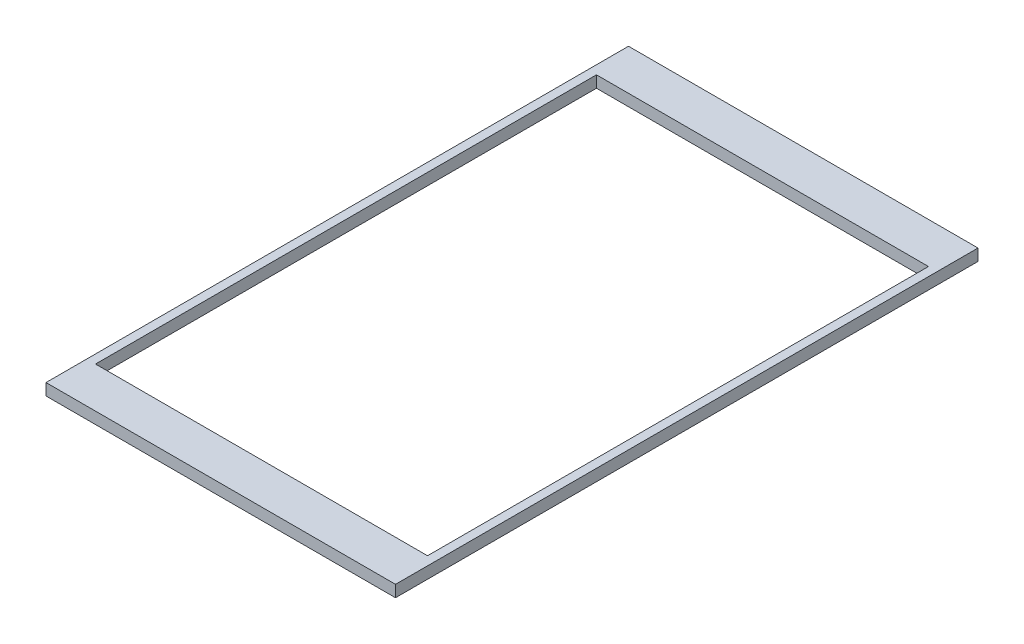
ISO-10303-21;
HEADER;
FILE_DESCRIPTION(('STEP AP214'),'2;1');
FILE_NAME('part.step','',(''),(''),'','','');
FILE_SCHEMA(('AUTOMOTIVE_DESIGN { 1 0 10303 214 1 1 1 1 }'));
ENDSEC;
DATA;
#1=APPLICATION_CONTEXT('core data for automotive mechanical design processes');
#2=APPLICATION_PROTOCOL_DEFINITION('international standard','automotive_design',2000,#1);
#3=PRODUCT_CONTEXT('',#1,'mechanical');
#4=PRODUCT('Part','Part','',(#3));
#5=PRODUCT_RELATED_PRODUCT_CATEGORY('part','',(#4));
#6=PRODUCT_DEFINITION_FORMATION('','',#4);
#7=PRODUCT_DEFINITION_CONTEXT('part definition',#1,'design');
#8=PRODUCT_DEFINITION('design','',#6,#7);
#9=PRODUCT_DEFINITION_SHAPE('','',#8);
#10=(LENGTH_UNIT() NAMED_UNIT(*) SI_UNIT(.MILLI.,.METRE.));
#11=(NAMED_UNIT(*) PLANE_ANGLE_UNIT() SI_UNIT($,.RADIAN.));
#12=(NAMED_UNIT(*) SI_UNIT($,.STERADIAN.) SOLID_ANGLE_UNIT());
#13=UNCERTAINTY_MEASURE_WITH_UNIT(LENGTH_MEASURE(1.E-05),#10,'distance_accuracy_value','');
#14=(GEOMETRIC_REPRESENTATION_CONTEXT(3) GLOBAL_UNCERTAINTY_ASSIGNED_CONTEXT((#13)) GLOBAL_UNIT_ASSIGNED_CONTEXT((#10,
#11,#12)) REPRESENTATION_CONTEXT('',''));
#15=CARTESIAN_POINT('',(0.,0.,0.));
#16=DIRECTION('',(0.,0.,1.));
#17=DIRECTION('',(1.,0.,0.));
#18=AXIS2_PLACEMENT_3D('',#15,#16,#17);
#19=CARTESIAN_POINT('',(38.1,2.54,63.5));
#20=DIRECTION('',(-1.,0.,0.));
#21=DIRECTION('',(0.,0.,1.));
#22=AXIS2_PLACEMENT_3D('',#19,#20,#21);
#23=PLANE('',#22);
#24=DIRECTION('',(0.,0.,-1.));
#25=VECTOR('',#24,1.);
#26=CARTESIAN_POINT('',(38.1,0.,63.5));
#27=LINE('',#26,#25);
#28=CARTESIAN_POINT('',(38.1,0.,63.5));
#29=VERTEX_POINT('',#28);
#30=CARTESIAN_POINT('',(38.1,0.,-63.5));
#31=VERTEX_POINT('',#30);
#32=EDGE_CURVE('E130',#29,#31,#27,.T.);
#33=ORIENTED_EDGE('',*,*,#32,.T.);
#34=DIRECTION('',(0.,-1.,0.));
#35=VECTOR('',#34,1.);
#36=CARTESIAN_POINT('',(38.1,2.54,-63.5));
#37=LINE('',#36,#35);
#38=CARTESIAN_POINT('',(38.1,2.54,-63.5));
#39=VERTEX_POINT('',#38);
#40=EDGE_CURVE('E11',#39,#31,#37,.T.);
#41=ORIENTED_EDGE('',*,*,#40,.F.);
#42=DIRECTION('',(0.,0.,-1.));
#43=VECTOR('',#42,1.);
#44=CARTESIAN_POINT('',(38.1,2.54,63.5));
#45=LINE('',#44,#43);
#46=CARTESIAN_POINT('',(38.1,2.54,63.5));
#47=VERTEX_POINT('',#46);
#48=EDGE_CURVE('E134',#47,#39,#45,.T.);
#49=ORIENTED_EDGE('',*,*,#48,.F.);
#50=DIRECTION('',(0.,-1.,0.));
#51=VECTOR('',#50,1.);
#52=CARTESIAN_POINT('',(38.1,2.54,63.5));
#53=LINE('',#52,#51);
#54=EDGE_CURVE('E144',#47,#29,#53,.T.);
#55=ORIENTED_EDGE('',*,*,#54,.T.);
#56=EDGE_LOOP('',(#33,#41,#49,#55));
#57=FACE_BOUND('',#56,.T.);
#58=ADVANCED_FACE('F33',(#57),#23,.F.);
#59=CARTESIAN_POINT('',(-38.1,2.54,-63.5));
#60=DIRECTION('',(0.,0.,1.));
#61=DIRECTION('',(1.,0.,0.));
#62=AXIS2_PLACEMENT_3D('',#59,#60,#61);
#63=PLANE('',#62);
#64=DIRECTION('',(-1.,0.,0.));
#65=VECTOR('',#64,1.);
#66=CARTESIAN_POINT('',(-38.1,0.,-63.5));
#67=LINE('',#66,#65);
#68=CARTESIAN_POINT('',(-38.1,0.,-63.5));
#69=VERTEX_POINT('',#68);
#70=EDGE_CURVE('E147',#31,#69,#67,.T.);
#71=ORIENTED_EDGE('',*,*,#70,.T.);
#72=DIRECTION('',(0.,-1.,0.));
#73=VECTOR('',#72,1.);
#74=CARTESIAN_POINT('',(-38.1,2.54,-63.5));
#75=LINE('',#74,#73);
#76=CARTESIAN_POINT('',(-38.1,2.54,-63.5));
#77=VERTEX_POINT('',#76);
#78=EDGE_CURVE('E40',#77,#69,#75,.T.);
#79=ORIENTED_EDGE('',*,*,#78,.F.);
#80=DIRECTION('',(-1.,0.,0.));
#81=VECTOR('',#80,1.);
#82=CARTESIAN_POINT('',(-38.1,2.54,-63.5));
#83=LINE('',#82,#81);
#84=EDGE_CURVE('E137',#39,#77,#83,.T.);
#85=ORIENTED_EDGE('',*,*,#84,.F.);
#86=ORIENTED_EDGE('',*,*,#40,.T.);
#87=EDGE_LOOP('',(#71,#79,#85,#86));
#88=FACE_BOUND('',#87,.T.);
#89=ADVANCED_FACE('F175',(#88),#63,.F.);
#90=CARTESIAN_POINT('',(-38.1,2.54,63.5));
#91=DIRECTION('',(1.,0.,0.));
#92=DIRECTION('',(0.,0.,-1.));
#93=AXIS2_PLACEMENT_3D('',#90,#91,#92);
#94=PLANE('',#93);
#95=DIRECTION('',(0.,0.,1.));
#96=VECTOR('',#95,1.);
#97=CARTESIAN_POINT('',(-38.1,0.,63.5));
#98=LINE('',#97,#96);
#99=CARTESIAN_POINT('',(-38.1,0.,63.5));
#100=VERTEX_POINT('',#99);
#101=EDGE_CURVE('E149',#69,#100,#98,.T.);
#102=ORIENTED_EDGE('',*,*,#101,.T.);
#103=DIRECTION('',(0.,-1.,0.));
#104=VECTOR('',#103,1.);
#105=CARTESIAN_POINT('',(-38.1,2.54,63.5));
#106=LINE('',#105,#104);
#107=CARTESIAN_POINT('',(-38.1,2.54,63.5));
#108=VERTEX_POINT('',#107);
#109=EDGE_CURVE('E154',#108,#100,#106,.T.);
#110=ORIENTED_EDGE('',*,*,#109,.F.);
#111=DIRECTION('',(0.,0.,1.));
#112=VECTOR('',#111,1.);
#113=CARTESIAN_POINT('',(-38.1,2.54,63.5));
#114=LINE('',#113,#112);
#115=EDGE_CURVE('E140',#77,#108,#114,.T.);
#116=ORIENTED_EDGE('',*,*,#115,.F.);
#117=ORIENTED_EDGE('',*,*,#78,.T.);
#118=EDGE_LOOP('',(#102,#110,#116,#117));
#119=FACE_BOUND('',#118,.T.);
#120=ADVANCED_FACE('F161',(#119),#94,.F.);
#121=CARTESIAN_POINT('',(-38.1,2.54,63.5));
#122=DIRECTION('',(0.,0.,-1.));
#123=DIRECTION('',(-1.,0.,0.));
#124=AXIS2_PLACEMENT_3D('',#121,#122,#123);
#125=PLANE('',#124);
#126=DIRECTION('',(1.,0.,0.));
#127=VECTOR('',#126,1.);
#128=CARTESIAN_POINT('',(-38.1,0.,63.5));
#129=LINE('',#128,#127);
#130=EDGE_CURVE('E138',#100,#29,#129,.T.);
#131=ORIENTED_EDGE('',*,*,#130,.T.);
#132=ORIENTED_EDGE('',*,*,#54,.F.);
#133=DIRECTION('',(1.,0.,0.));
#134=VECTOR('',#133,1.);
#135=CARTESIAN_POINT('',(-38.1,2.54,63.5));
#136=LINE('',#135,#134);
#137=EDGE_CURVE('E142',#108,#47,#136,.T.);
#138=ORIENTED_EDGE('',*,*,#137,.F.);
#139=ORIENTED_EDGE('',*,*,#109,.T.);
#140=EDGE_LOOP('',(#131,#132,#138,#139));
#141=FACE_BOUND('',#140,.T.);
#142=ADVANCED_FACE('F168',(#141),#125,.F.);
#143=CARTESIAN_POINT('',(0.,2.54,0.));
#144=DIRECTION('',(0.,-1.,0.));
#145=DIRECTION('',(0.,0.,-1.));
#146=AXIS2_PLACEMENT_3D('',#143,#144,#145);
#147=PLANE('',#146);
#148=DIRECTION('',(-1.,0.,0.));
#149=VECTOR('',#148,1.);
#150=CARTESIAN_POINT('',(-36.195,2.54,-54.61));
#151=LINE('',#150,#149);
#152=CARTESIAN_POINT('',(36.195,2.54,-54.61));
#153=VERTEX_POINT('',#152);
#154=CARTESIAN_POINT('',(-36.195,2.54,-54.61));
#155=VERTEX_POINT('',#154);
#156=EDGE_CURVE('E124',#153,#155,#151,.T.);
#157=ORIENTED_EDGE('',*,*,#156,.F.);
#158=DIRECTION('',(0.,0.,-1.));
#159=VECTOR('',#158,1.);
#160=CARTESIAN_POINT('',(36.195,2.54,54.61));
#161=LINE('',#160,#159);
#162=CARTESIAN_POINT('',(36.195,2.54,54.61));
#163=VERTEX_POINT('',#162);
#164=EDGE_CURVE('E47',#163,#153,#161,.T.);
#165=ORIENTED_EDGE('',*,*,#164,.F.);
#166=DIRECTION('',(1.,0.,0.));
#167=VECTOR('',#166,1.);
#168=CARTESIAN_POINT('',(-36.195,2.54,54.61));
#169=LINE('',#168,#167);
#170=CARTESIAN_POINT('',(-36.195,2.54,54.61));
#171=VERTEX_POINT('',#170);
#172=EDGE_CURVE('E115',#171,#163,#169,.T.);
#173=ORIENTED_EDGE('',*,*,#172,.F.);
#174=DIRECTION('',(0.,0.,1.));
#175=VECTOR('',#174,1.);
#176=CARTESIAN_POINT('',(-36.195,2.54,54.61));
#177=LINE('',#176,#175);
#178=EDGE_CURVE('E118',#155,#171,#177,.T.);
#179=ORIENTED_EDGE('',*,*,#178,.F.);
#180=EDGE_LOOP('',(#157,#165,#173,#179));
#181=FACE_BOUND('',#180,.T.);
#182=ORIENTED_EDGE('',*,*,#48,.T.);
#183=ORIENTED_EDGE('',*,*,#84,.T.);
#184=ORIENTED_EDGE('',*,*,#115,.T.);
#185=ORIENTED_EDGE('',*,*,#137,.T.);
#186=EDGE_LOOP('',(#182,#183,#184,#185));
#187=FACE_BOUND('',#186,.T.);
#188=ADVANCED_FACE('F174',(#181,#187),#147,.F.);
#189=CARTESIAN_POINT('',(0.,0.,0.));
#190=DIRECTION('',(0.,-1.,0.));
#191=DIRECTION('',(0.,0.,-1.));
#192=AXIS2_PLACEMENT_3D('',#189,#190,#191);
#193=PLANE('',#192);
#194=DIRECTION('',(0.,0.,-1.));
#195=VECTOR('',#194,1.);
#196=CARTESIAN_POINT('',(36.195,0.,54.61));
#197=LINE('',#196,#195);
#198=CARTESIAN_POINT('',(36.195,0.,54.61));
#199=VERTEX_POINT('',#198);
#200=CARTESIAN_POINT('',(36.195,0.,-54.61));
#201=VERTEX_POINT('',#200);
#202=EDGE_CURVE('E99',#199,#201,#197,.T.);
#203=ORIENTED_EDGE('',*,*,#202,.T.);
#204=DIRECTION('',(-1.,0.,0.));
#205=VECTOR('',#204,1.);
#206=CARTESIAN_POINT('',(-36.195,0.,-54.61));
#207=LINE('',#206,#205);
#208=CARTESIAN_POINT('',(-36.195,0.,-54.61));
#209=VERTEX_POINT('',#208);
#210=EDGE_CURVE('E108',#201,#209,#207,.T.);
#211=ORIENTED_EDGE('',*,*,#210,.T.);
#212=DIRECTION('',(0.,0.,1.));
#213=VECTOR('',#212,1.);
#214=CARTESIAN_POINT('',(-36.195,0.,54.61));
#215=LINE('',#214,#213);
#216=CARTESIAN_POINT('',(-36.195,0.,54.61));
#217=VERTEX_POINT('',#216);
#218=EDGE_CURVE('E55',#209,#217,#215,.T.);
#219=ORIENTED_EDGE('',*,*,#218,.T.);
#220=DIRECTION('',(1.,0.,0.));
#221=VECTOR('',#220,1.);
#222=CARTESIAN_POINT('',(-36.195,0.,54.61));
#223=LINE('',#222,#221);
#224=EDGE_CURVE('E105',#217,#199,#223,.T.);
#225=ORIENTED_EDGE('',*,*,#224,.T.);
#226=EDGE_LOOP('',(#203,#211,#219,#225));
#227=FACE_BOUND('',#226,.T.);
#228=ORIENTED_EDGE('',*,*,#32,.F.);
#229=ORIENTED_EDGE('',*,*,#130,.F.);
#230=ORIENTED_EDGE('',*,*,#101,.F.);
#231=ORIENTED_EDGE('',*,*,#70,.F.);
#232=EDGE_LOOP('',(#228,#229,#230,#231));
#233=FACE_BOUND('',#232,.T.);
#234=ADVANCED_FACE('F112',(#227,#233),#193,.T.);
#235=CARTESIAN_POINT('',(36.195,0.,54.61));
#236=DIRECTION('',(1.,0.,0.));
#237=DIRECTION('',(0.,0.,-1.));
#238=AXIS2_PLACEMENT_3D('',#235,#236,#237);
#239=PLANE('',#238);
#240=ORIENTED_EDGE('',*,*,#164,.T.);
#241=DIRECTION('',(0.,1.,0.));
#242=VECTOR('',#241,1.);
#243=CARTESIAN_POINT('',(36.195,0.,-54.61));
#244=LINE('',#243,#242);
#245=EDGE_CURVE('E95',#201,#153,#244,.T.);
#246=ORIENTED_EDGE('',*,*,#245,.F.);
#247=ORIENTED_EDGE('',*,*,#202,.F.);
#248=DIRECTION('',(0.,1.,0.));
#249=VECTOR('',#248,1.);
#250=CARTESIAN_POINT('',(36.195,0.,54.61));
#251=LINE('',#250,#249);
#252=EDGE_CURVE('E128',#199,#163,#251,.T.);
#253=ORIENTED_EDGE('',*,*,#252,.T.);
#254=EDGE_LOOP('',(#240,#246,#247,#253));
#255=FACE_BOUND('',#254,.T.);
#256=ADVANCED_FACE('F97',(#255),#239,.F.);
#257=CARTESIAN_POINT('',(-36.195,0.,54.61));
#258=DIRECTION('',(0.,0.,1.));
#259=DIRECTION('',(1.,0.,0.));
#260=AXIS2_PLACEMENT_3D('',#257,#258,#259);
#261=PLANE('',#260);
#262=ORIENTED_EDGE('',*,*,#172,.T.);
#263=ORIENTED_EDGE('',*,*,#252,.F.);
#264=ORIENTED_EDGE('',*,*,#224,.F.);
#265=DIRECTION('',(0.,1.,0.));
#266=VECTOR('',#265,1.);
#267=CARTESIAN_POINT('',(-36.195,0.,54.61));
#268=LINE('',#267,#266);
#269=EDGE_CURVE('E131',#217,#171,#268,.T.);
#270=ORIENTED_EDGE('',*,*,#269,.T.);
#271=EDGE_LOOP('',(#262,#263,#264,#270));
#272=FACE_BOUND('',#271,.T.);
#273=ADVANCED_FACE('F192',(#272),#261,.F.);
#274=CARTESIAN_POINT('',(-36.195,0.,54.61));
#275=DIRECTION('',(-1.,0.,0.));
#276=DIRECTION('',(0.,0.,1.));
#277=AXIS2_PLACEMENT_3D('',#274,#275,#276);
#278=PLANE('',#277);
#279=ORIENTED_EDGE('',*,*,#178,.T.);
#280=ORIENTED_EDGE('',*,*,#269,.F.);
#281=ORIENTED_EDGE('',*,*,#218,.F.);
#282=DIRECTION('',(0.,1.,0.));
#283=VECTOR('',#282,1.);
#284=CARTESIAN_POINT('',(-36.195,0.,-54.61));
#285=LINE('',#284,#283);
#286=EDGE_CURVE('E104',#209,#155,#285,.T.);
#287=ORIENTED_EDGE('',*,*,#286,.T.);
#288=EDGE_LOOP('',(#279,#280,#281,#287));
#289=FACE_BOUND('',#288,.T.);
#290=ADVANCED_FACE('F195',(#289),#278,.F.);
#291=CARTESIAN_POINT('',(-36.195,0.,-54.61));
#292=DIRECTION('',(0.,0.,-1.));
#293=DIRECTION('',(-1.,0.,0.));
#294=AXIS2_PLACEMENT_3D('',#291,#292,#293);
#295=PLANE('',#294);
#296=ORIENTED_EDGE('',*,*,#156,.T.);
#297=ORIENTED_EDGE('',*,*,#286,.F.);
#298=ORIENTED_EDGE('',*,*,#210,.F.);
#299=ORIENTED_EDGE('',*,*,#245,.T.);
#300=EDGE_LOOP('',(#296,#297,#298,#299));
#301=FACE_BOUND('',#300,.T.);
#302=ADVANCED_FACE('F109',(#301),#295,.F.);
#303=CLOSED_SHELL('',(#58,#89,#120,#142,#188,#234,#256,#273,#290,#302));
#304=MANIFOLD_SOLID_BREP('B2',#303);
#305=ADVANCED_BREP_SHAPE_REPRESENTATION('',(#18,#304),#14);
#306=SHAPE_DEFINITION_REPRESENTATION(#9,#305);
ENDSEC;
END-ISO-10303-21;
